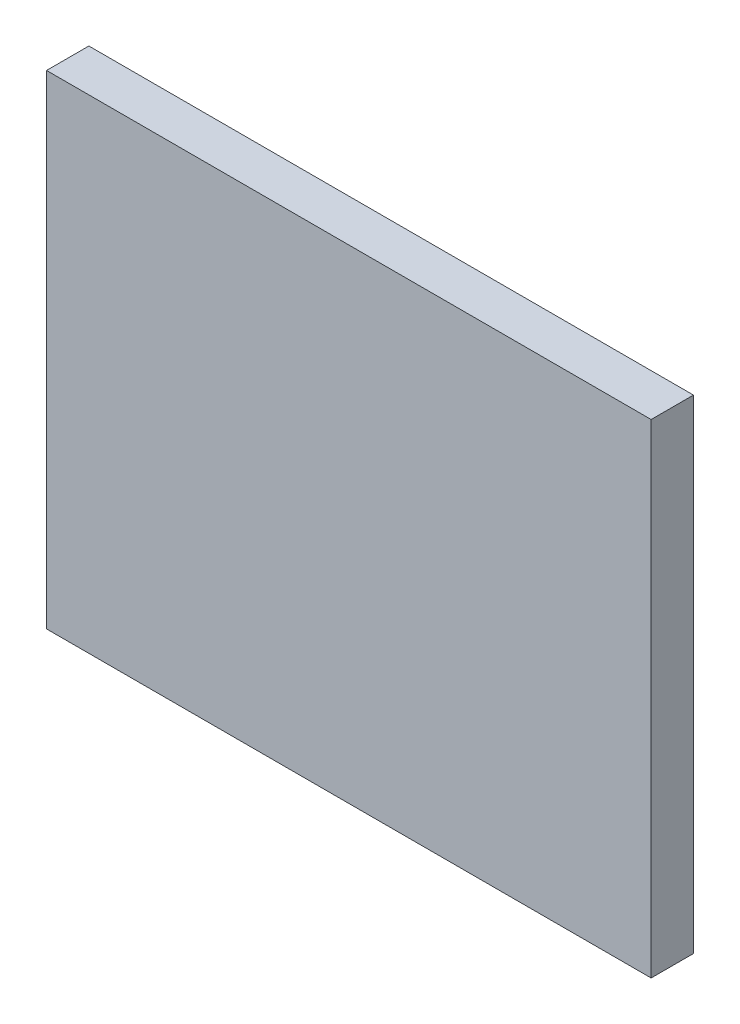
ISO-10303-21;
HEADER;
FILE_DESCRIPTION(('STEP AP214'),'2;1');
FILE_NAME('part.step','',(''),(''),'','','');
FILE_SCHEMA(('AUTOMOTIVE_DESIGN { 1 0 10303 214 1 1 1 1 }'));
ENDSEC;
DATA;
#1=APPLICATION_CONTEXT('core data for automotive mechanical design processes');
#2=APPLICATION_PROTOCOL_DEFINITION('international standard','automotive_design',2000,#1);
#3=PRODUCT_CONTEXT('',#1,'mechanical');
#4=PRODUCT('Part','Part','',(#3));
#5=PRODUCT_RELATED_PRODUCT_CATEGORY('part','',(#4));
#6=PRODUCT_DEFINITION_FORMATION('','',#4);
#7=PRODUCT_DEFINITION_CONTEXT('part definition',#1,'design');
#8=PRODUCT_DEFINITION('design','',#6,#7);
#9=PRODUCT_DEFINITION_SHAPE('','',#8);
#10=(LENGTH_UNIT() NAMED_UNIT(*) SI_UNIT(.MILLI.,.METRE.));
#11=(NAMED_UNIT(*) PLANE_ANGLE_UNIT() SI_UNIT($,.RADIAN.));
#12=(NAMED_UNIT(*) SI_UNIT($,.STERADIAN.) SOLID_ANGLE_UNIT());
#13=UNCERTAINTY_MEASURE_WITH_UNIT(LENGTH_MEASURE(1.E-05),#10,'distance_accuracy_value','');
#14=(GEOMETRIC_REPRESENTATION_CONTEXT(3) GLOBAL_UNCERTAINTY_ASSIGNED_CONTEXT((#13)) GLOBAL_UNIT_ASSIGNED_CONTEXT((#10,
#11,#12)) REPRESENTATION_CONTEXT('',''));
#15=CARTESIAN_POINT('',(0.,0.,0.));
#16=DIRECTION('',(0.,0.,1.));
#17=DIRECTION('',(1.,0.,0.));
#18=AXIS2_PLACEMENT_3D('',#15,#16,#17);
#19=CARTESIAN_POINT('',(-3.,10.1,0.37));
#20=DIRECTION('',(-1.,0.,0.));
#21=DIRECTION('',(0.,-1.,0.));
#22=AXIS2_PLACEMENT_3D('',#19,#20,#21);
#23=PLANE('',#22);
#24=DIRECTION('',(0.,0.,1.));
#25=VECTOR('',#24,1.);
#26=CARTESIAN_POINT('',(-3.,10.1,0.405));
#27=LINE('',#26,#25);
#28=CARTESIAN_POINT('',(-3.,10.1,0.37));
#29=VERTEX_POINT('',#28);
#30=CARTESIAN_POINT('',(-3.,10.1,0.44));
#31=VERTEX_POINT('',#30);
#32=EDGE_CURVE('E11',#29,#31,#27,.T.);
#33=ORIENTED_EDGE('',*,*,#32,.F.);
#34=DIRECTION('',(0.,-1.,0.));
#35=VECTOR('',#34,1.);
#36=CARTESIAN_POINT('',(-3.,9.7,0.37));
#37=LINE('',#36,#35);
#38=CARTESIAN_POINT('',(-3.,9.3,0.37));
#39=VERTEX_POINT('',#38);
#40=EDGE_CURVE('E25',#29,#39,#37,.T.);
#41=ORIENTED_EDGE('',*,*,#40,.T.);
#42=DIRECTION('',(0.,0.,1.));
#43=VECTOR('',#42,1.);
#44=CARTESIAN_POINT('',(-3.,9.3,0.405));
#45=LINE('',#44,#43);
#46=CARTESIAN_POINT('',(-3.,9.3,0.44));
#47=VERTEX_POINT('',#46);
#48=EDGE_CURVE('E73',#39,#47,#45,.T.);
#49=ORIENTED_EDGE('',*,*,#48,.T.);
#50=DIRECTION('',(0.,-1.,0.));
#51=VECTOR('',#50,1.);
#52=CARTESIAN_POINT('',(-3.,9.7,0.44));
#53=LINE('',#52,#51);
#54=EDGE_CURVE('E99',#31,#47,#53,.T.);
#55=ORIENTED_EDGE('',*,*,#54,.F.);
#56=EDGE_LOOP('',(#33,#41,#49,#55));
#57=FACE_BOUND('',#56,.T.);
#58=ADVANCED_FACE('F17',(#57),#23,.T.);
#59=CARTESIAN_POINT('',(0.,0.,0.44));
#60=DIRECTION('',(0.,0.,1.));
#61=DIRECTION('',(1.,0.,0.));
#62=AXIS2_PLACEMENT_3D('',#59,#60,#61);
#63=PLANE('',#62);
#64=ORIENTED_EDGE('',*,*,#54,.T.);
#65=DIRECTION('',(-1.,0.,0.));
#66=VECTOR('',#65,1.);
#67=CARTESIAN_POINT('',(-2.5,9.3,0.44));
#68=LINE('',#67,#66);
#69=CARTESIAN_POINT('',(-2.,9.3,0.44));
#70=VERTEX_POINT('',#69);
#71=EDGE_CURVE('E95',#70,#47,#68,.T.);
#72=ORIENTED_EDGE('',*,*,#71,.F.);
#73=DIRECTION('',(0.,1.,0.));
#74=VECTOR('',#73,1.);
#75=CARTESIAN_POINT('',(-2.,9.7,0.44));
#76=LINE('',#75,#74);
#77=CARTESIAN_POINT('',(-2.,10.1,0.44));
#78=VERTEX_POINT('',#77);
#79=EDGE_CURVE('E68',#70,#78,#76,.T.);
#80=ORIENTED_EDGE('',*,*,#79,.T.);
#81=DIRECTION('',(1.,0.,0.));
#82=VECTOR('',#81,1.);
#83=CARTESIAN_POINT('',(-2.5,10.1,0.44));
#84=LINE('',#83,#82);
#85=EDGE_CURVE('E87',#31,#78,#84,.T.);
#86=ORIENTED_EDGE('',*,*,#85,.F.);
#87=EDGE_LOOP('',(#64,#72,#80,#86));
#88=FACE_BOUND('',#87,.T.);
#89=ADVANCED_FACE('F113',(#88),#63,.T.);
#90=CARTESIAN_POINT('',(-3.,10.1,0.37));
#91=DIRECTION('',(0.,-1.,0.));
#92=DIRECTION('',(1.,0.,0.));
#93=AXIS2_PLACEMENT_3D('',#90,#91,#92);
#94=PLANE('',#93);
#95=DIRECTION('',(0.,0.,1.));
#96=VECTOR('',#95,1.);
#97=CARTESIAN_POINT('',(-2.,10.1,0.405));
#98=LINE('',#97,#96);
#99=CARTESIAN_POINT('',(-2.,10.1,0.37));
#100=VERTEX_POINT('',#99);
#101=EDGE_CURVE('E83',#100,#78,#98,.T.);
#102=ORIENTED_EDGE('',*,*,#101,.F.);
#103=DIRECTION('',(1.,0.,0.));
#104=VECTOR('',#103,1.);
#105=CARTESIAN_POINT('',(-2.5,10.1,0.37));
#106=LINE('',#105,#104);
#107=EDGE_CURVE('E60',#29,#100,#106,.T.);
#108=ORIENTED_EDGE('',*,*,#107,.F.);
#109=ORIENTED_EDGE('',*,*,#32,.T.);
#110=ORIENTED_EDGE('',*,*,#85,.T.);
#111=EDGE_LOOP('',(#102,#108,#109,#110));
#112=FACE_BOUND('',#111,.T.);
#113=ADVANCED_FACE('F115',(#112),#94,.F.);
#114=CARTESIAN_POINT('',(0.,0.,0.37));
#115=DIRECTION('',(0.,0.,1.));
#116=DIRECTION('',(1.,0.,0.));
#117=AXIS2_PLACEMENT_3D('',#114,#115,#116);
#118=PLANE('',#117);
#119=ORIENTED_EDGE('',*,*,#107,.T.);
#120=DIRECTION('',(0.,1.,0.));
#121=VECTOR('',#120,1.);
#122=CARTESIAN_POINT('',(-2.,9.7,0.37));
#123=LINE('',#122,#121);
#124=CARTESIAN_POINT('',(-2.,9.3,0.37));
#125=VERTEX_POINT('',#124);
#126=EDGE_CURVE('E54',#125,#100,#123,.T.);
#127=ORIENTED_EDGE('',*,*,#126,.F.);
#128=DIRECTION('',(-1.,0.,0.));
#129=VECTOR('',#128,1.);
#130=CARTESIAN_POINT('',(-2.5,9.3,0.37));
#131=LINE('',#130,#129);
#132=EDGE_CURVE('E58',#125,#39,#131,.T.);
#133=ORIENTED_EDGE('',*,*,#132,.T.);
#134=ORIENTED_EDGE('',*,*,#40,.F.);
#135=EDGE_LOOP('',(#119,#127,#133,#134));
#136=FACE_BOUND('',#135,.T.);
#137=ADVANCED_FACE('F56',(#136),#118,.F.);
#138=CARTESIAN_POINT('',(-2.,9.3,0.37));
#139=DIRECTION('',(0.,1.,0.));
#140=DIRECTION('',(-1.,0.,0.));
#141=AXIS2_PLACEMENT_3D('',#138,#139,#140);
#142=PLANE('',#141);
#143=ORIENTED_EDGE('',*,*,#48,.F.);
#144=ORIENTED_EDGE('',*,*,#132,.F.);
#145=DIRECTION('',(0.,0.,1.));
#146=VECTOR('',#145,1.);
#147=CARTESIAN_POINT('',(-2.,9.3,0.405));
#148=LINE('',#147,#146);
#149=EDGE_CURVE('E66',#125,#70,#148,.T.);
#150=ORIENTED_EDGE('',*,*,#149,.T.);
#151=ORIENTED_EDGE('',*,*,#71,.T.);
#152=EDGE_LOOP('',(#143,#144,#150,#151));
#153=FACE_BOUND('',#152,.T.);
#154=ADVANCED_FACE('F72',(#153),#142,.F.);
#155=CARTESIAN_POINT('',(-2.,9.3,0.37));
#156=DIRECTION('',(1.,0.,0.));
#157=DIRECTION('',(0.,1.,0.));
#158=AXIS2_PLACEMENT_3D('',#155,#156,#157);
#159=PLANE('',#158);
#160=ORIENTED_EDGE('',*,*,#149,.F.);
#161=ORIENTED_EDGE('',*,*,#126,.T.);
#162=ORIENTED_EDGE('',*,*,#101,.T.);
#163=ORIENTED_EDGE('',*,*,#79,.F.);
#164=EDGE_LOOP('',(#160,#161,#162,#163));
#165=FACE_BOUND('',#164,.T.);
#166=ADVANCED_FACE('F67',(#165),#159,.T.);
#167=CLOSED_SHELL('',(#58,#89,#113,#137,#154,#166));
#168=MANIFOLD_SOLID_BREP('B1',#167);
#169=ADVANCED_BREP_SHAPE_REPRESENTATION('',(#18,#168),#14);
#170=SHAPE_DEFINITION_REPRESENTATION(#9,#169);
ENDSEC;
END-ISO-10303-21;
